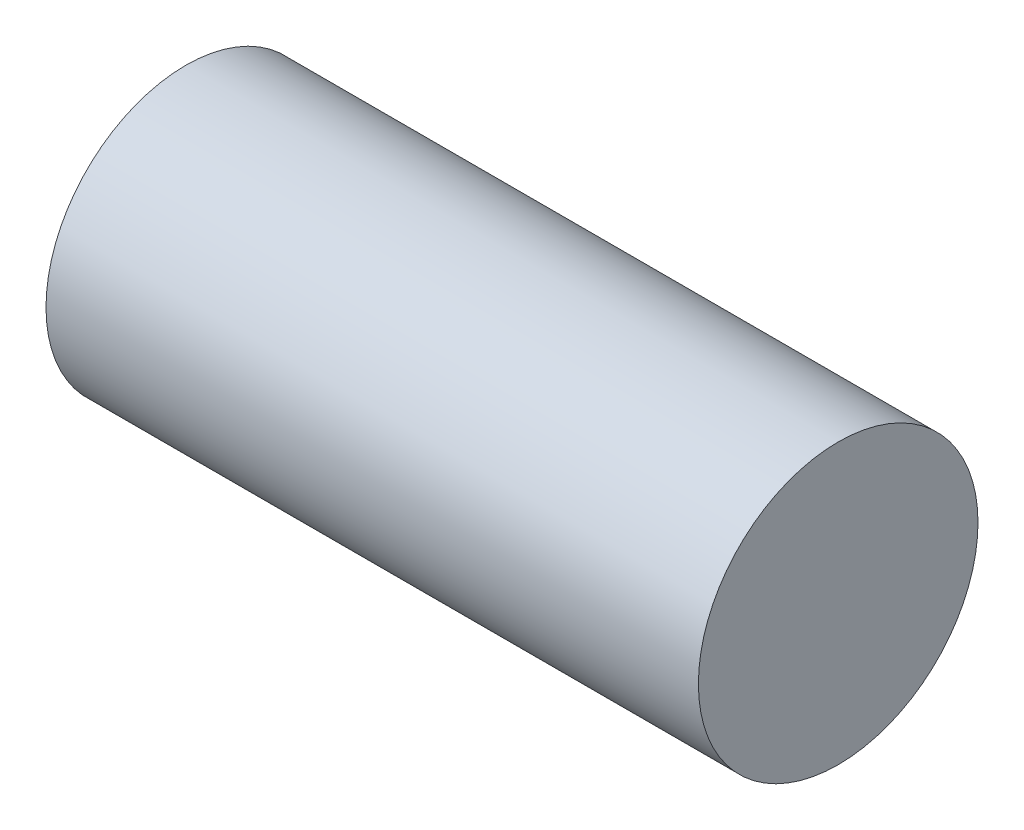
ISO-10303-21;
HEADER;
FILE_DESCRIPTION(('STEP AP214'),'2;1');
FILE_NAME('part.step','',(''),(''),'','','');
FILE_SCHEMA(('AUTOMOTIVE_DESIGN { 1 0 10303 214 1 1 1 1 }'));
ENDSEC;
DATA;
#1=APPLICATION_CONTEXT('core data for automotive mechanical design processes');
#2=APPLICATION_PROTOCOL_DEFINITION('international standard','automotive_design',2000,#1);
#3=PRODUCT_CONTEXT('',#1,'mechanical');
#4=PRODUCT('Part','Part','',(#3));
#5=PRODUCT_RELATED_PRODUCT_CATEGORY('part','',(#4));
#6=PRODUCT_DEFINITION_FORMATION('','',#4);
#7=PRODUCT_DEFINITION_CONTEXT('part definition',#1,'design');
#8=PRODUCT_DEFINITION('design','',#6,#7);
#9=PRODUCT_DEFINITION_SHAPE('','',#8);
#10=(LENGTH_UNIT() NAMED_UNIT(*) SI_UNIT(.MILLI.,.METRE.));
#11=(NAMED_UNIT(*) PLANE_ANGLE_UNIT() SI_UNIT($,.RADIAN.));
#12=(NAMED_UNIT(*) SI_UNIT($,.STERADIAN.) SOLID_ANGLE_UNIT());
#13=UNCERTAINTY_MEASURE_WITH_UNIT(LENGTH_MEASURE(1.E-05),#10,'distance_accuracy_value','');
#14=(GEOMETRIC_REPRESENTATION_CONTEXT(3) GLOBAL_UNCERTAINTY_ASSIGNED_CONTEXT((#13)) GLOBAL_UNIT_ASSIGNED_CONTEXT((#10,
#11,#12)) REPRESENTATION_CONTEXT('',''));
#15=CARTESIAN_POINT('',(0.,0.,0.));
#16=DIRECTION('',(0.,0.,1.));
#17=DIRECTION('',(1.,0.,0.));
#18=AXIS2_PLACEMENT_3D('',#15,#16,#17);
#19=CARTESIAN_POINT('',(0.,0.,0.));
#20=DIRECTION('',(-1.,0.,0.));
#21=DIRECTION('',(0.,0.,1.));
#22=AXIS2_PLACEMENT_3D('',#19,#20,#21);
#23=CYLINDRICAL_SURFACE('',#22,1.5);
#24=CARTESIAN_POINT('',(-3.5,0.,0.));
#25=DIRECTION('',(-1.,0.,0.));
#26=DIRECTION('',(0.,0.,1.));
#27=AXIS2_PLACEMENT_3D('',#24,#25,#26);
#28=CIRCLE('',#27,1.5);
#29=CARTESIAN_POINT('',(-3.5,0.,1.5));
#30=VERTEX_POINT('',#29);
#31=EDGE_CURVE('E10',#30,#30,#28,.T.);
#32=ORIENTED_EDGE('',*,*,#31,.F.);
#33=EDGE_LOOP('',(#32));
#34=FACE_BOUND('',#33,.T.);
#35=CARTESIAN_POINT('',(3.5,0.,0.));
#36=DIRECTION('',(-1.,0.,0.));
#37=DIRECTION('',(0.,0.,1.));
#38=AXIS2_PLACEMENT_3D('',#35,#36,#37);
#39=CIRCLE('',#38,1.5);
#40=CARTESIAN_POINT('',(3.5,0.,1.5));
#41=VERTEX_POINT('',#40);
#42=EDGE_CURVE('E43',#41,#41,#39,.T.);
#43=ORIENTED_EDGE('',*,*,#42,.T.);
#44=EDGE_LOOP('',(#43));
#45=FACE_BOUND('',#44,.T.);
#46=ADVANCED_FACE('F40',(#34,#45),#23,.T.);
#47=CARTESIAN_POINT('',(-3.5,0.,0.));
#48=DIRECTION('',(-1.,0.,0.));
#49=DIRECTION('',(0.,0.,1.));
#50=AXIS2_PLACEMENT_3D('',#47,#48,#49);
#51=PLANE('',#50);
#52=ORIENTED_EDGE('',*,*,#31,.T.);
#53=EDGE_LOOP('',(#52));
#54=FACE_BOUND('',#53,.T.);
#55=ADVANCED_FACE('F55',(#54),#51,.T.);
#56=CARTESIAN_POINT('',(3.5,0.,0.));
#57=DIRECTION('',(1.,0.,0.));
#58=DIRECTION('',(0.,0.,1.));
#59=AXIS2_PLACEMENT_3D('',#56,#57,#58);
#60=PLANE('',#59);
#61=ORIENTED_EDGE('',*,*,#42,.F.);
#62=EDGE_LOOP('',(#61));
#63=FACE_BOUND('',#62,.T.);
#64=ADVANCED_FACE('F49',(#63),#60,.T.);
#65=CLOSED_SHELL('',(#46,#55,#64));
#66=MANIFOLD_SOLID_BREP('B2',#65);
#67=ADVANCED_BREP_SHAPE_REPRESENTATION('',(#18,#66),#14);
#68=SHAPE_DEFINITION_REPRESENTATION(#9,#67);
ENDSEC;
END-ISO-10303-21;
